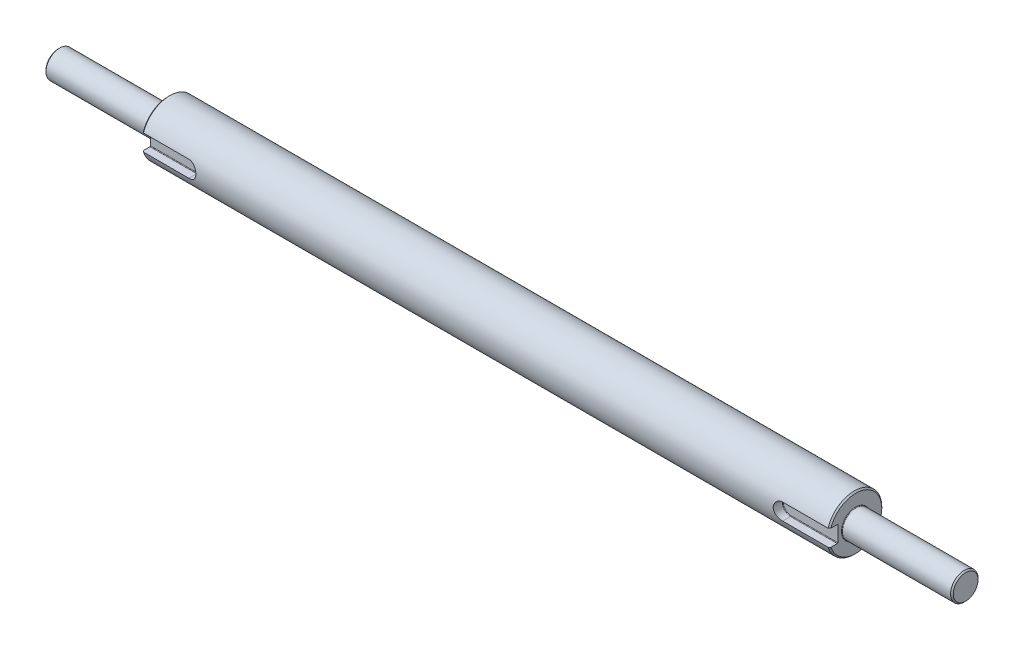
ISO-10303-21;
HEADER;
FILE_DESCRIPTION(('STEP AP214'),'2;1');
FILE_NAME('part.step','',(''),(''),'','','');
FILE_SCHEMA(('AUTOMOTIVE_DESIGN { 1 0 10303 214 1 1 1 1 }'));
ENDSEC;
DATA;
#1=APPLICATION_CONTEXT('core data for automotive mechanical design processes');
#2=APPLICATION_PROTOCOL_DEFINITION('international standard','automotive_design',2000,#1);
#3=PRODUCT_CONTEXT('',#1,'mechanical');
#4=PRODUCT('Part','Part','',(#3));
#5=PRODUCT_RELATED_PRODUCT_CATEGORY('part','',(#4));
#6=PRODUCT_DEFINITION_FORMATION('','',#4);
#7=PRODUCT_DEFINITION_CONTEXT('part definition',#1,'design');
#8=PRODUCT_DEFINITION('design','',#6,#7);
#9=PRODUCT_DEFINITION_SHAPE('','',#8);
#10=(LENGTH_UNIT() NAMED_UNIT(*) SI_UNIT(.MILLI.,.METRE.));
#11=(NAMED_UNIT(*) PLANE_ANGLE_UNIT() SI_UNIT($,.RADIAN.));
#12=(NAMED_UNIT(*) SI_UNIT($,.STERADIAN.) SOLID_ANGLE_UNIT());
#13=UNCERTAINTY_MEASURE_WITH_UNIT(LENGTH_MEASURE(1.E-05),#10,'distance_accuracy_value','');
#14=(GEOMETRIC_REPRESENTATION_CONTEXT(3) GLOBAL_UNCERTAINTY_ASSIGNED_CONTEXT((#13)) GLOBAL_UNIT_ASSIGNED_CONTEXT((#10,
#11,#12)) REPRESENTATION_CONTEXT('',''));
#15=CARTESIAN_POINT('',(0.,0.,0.));
#16=DIRECTION('',(0.,0.,1.));
#17=DIRECTION('',(1.,0.,0.));
#18=AXIS2_PLACEMENT_3D('',#15,#16,#17);
#19=CARTESIAN_POINT('',(330.,5.,0.));
#20=DIRECTION('',(-1.,0.,0.));
#21=DIRECTION('',(0.,0.,1.));
#22=AXIS2_PLACEMENT_3D('',#19,#20,#21);
#23=PLANE('',#22);
#24=CARTESIAN_POINT('',(330.,0.,0.));
#25=DIRECTION('',(-1.,0.,0.));
#26=DIRECTION('',(0.,0.,1.));
#27=AXIS2_PLACEMENT_3D('',#24,#25,#26);
#28=CIRCLE('',#27,4.50000000000006);
#29=CARTESIAN_POINT('',(330.,0.,4.50000000000006));
#30=VERTEX_POINT('',#29);
#31=EDGE_CURVE('E250',#30,#30,#28,.F.);
#32=ORIENTED_EDGE('',*,*,#31,.T.);
#33=EDGE_LOOP('',(#32));
#34=FACE_BOUND('',#33,.T.);
#35=ADVANCED_FACE('F49',(#34),#23,.F.);
#36=CARTESIAN_POINT('',(0.,0.,0.));
#37=DIRECTION('',(-1.,0.,0.));
#38=DIRECTION('',(0.,0.,1.));
#39=AXIS2_PLACEMENT_3D('',#36,#37,#38);
#40=CYLINDRICAL_SURFACE('',#39,5.);
#41=CARTESIAN_POINT('',(290.2,0.,0.));
#42=DIRECTION('',(-1.,0.,0.));
#43=DIRECTION('',(0.,0.,1.));
#44=AXIS2_PLACEMENT_3D('',#41,#42,#43);
#45=CIRCLE('',#44,5.);
#46=CARTESIAN_POINT('',(290.2,0.,5.));
#47=VERTEX_POINT('',#46);
#48=EDGE_CURVE('E262',#47,#47,#45,.F.);
#49=ORIENTED_EDGE('',*,*,#48,.T.);
#50=EDGE_LOOP('',(#49));
#51=FACE_BOUND('',#50,.T.);
#52=CARTESIAN_POINT('',(329.5,0.,0.));
#53=DIRECTION('',(-1.,0.,0.));
#54=DIRECTION('',(0.,0.,1.));
#55=AXIS2_PLACEMENT_3D('',#52,#53,#54);
#56=CIRCLE('',#55,5.);
#57=CARTESIAN_POINT('',(329.5,0.,5.));
#58=VERTEX_POINT('',#57);
#59=EDGE_CURVE('E247',#58,#58,#56,.T.);
#60=ORIENTED_EDGE('',*,*,#59,.T.);
#61=EDGE_LOOP('',(#60));
#62=FACE_BOUND('',#61,.T.);
#63=ADVANCED_FACE('F353',(#51,#62),#40,.T.);
#64=CARTESIAN_POINT('',(290.,5.,0.));
#65=DIRECTION('',(-1.,0.,0.));
#66=DIRECTION('',(0.,0.,1.));
#67=AXIS2_PLACEMENT_3D('',#64,#65,#66);
#68=PLANE('',#67);
#69=CARTESIAN_POINT('',(290.,0.,0.));
#70=DIRECTION('',(-1.,0.,0.));
#71=DIRECTION('',(0.,0.,1.));
#72=AXIS2_PLACEMENT_3D('',#69,#70,#71);
#73=CIRCLE('',#72,9.49999999999995);
#74=CARTESIAN_POINT('',(290.,-3.,9.01387818865992));
#75=VERTEX_POINT('',#74);
#76=CARTESIAN_POINT('',(290.,3.,9.01387818865992));
#77=VERTEX_POINT('',#76);
#78=EDGE_CURVE('E233',#75,#77,#73,.F.);
#79=ORIENTED_EDGE('',*,*,#78,.T.);
#80=DIRECTION('',(0.,0.,1.));
#81=VECTOR('',#80,1.);
#82=CARTESIAN_POINT('',(290.,3.,6.5));
#83=LINE('',#82,#81);
#84=CARTESIAN_POINT('',(290.,3.,6.7));
#85=VERTEX_POINT('',#84);
#86=EDGE_CURVE('E64',#77,#85,#83,.F.);
#87=ORIENTED_EDGE('',*,*,#86,.T.);
#88=CARTESIAN_POINT('',(290.,2.8,6.7));
#89=DIRECTION('',(1.,0.,0.));
#90=DIRECTION('',(0.,0.,-1.));
#91=AXIS2_PLACEMENT_3D('',#88,#89,#90);
#92=CIRCLE('',#91,0.2);
#93=CARTESIAN_POINT('',(290.,2.8,6.5));
#94=VERTEX_POINT('',#93);
#95=EDGE_CURVE('E162',#94,#85,#92,.T.);
#96=ORIENTED_EDGE('',*,*,#95,.F.);
#97=DIRECTION('',(0.,-1.,0.));
#98=VECTOR('',#97,1.);
#99=CARTESIAN_POINT('',(290.,5.,6.5));
#100=LINE('',#99,#98);
#101=CARTESIAN_POINT('',(290.,-2.8,6.5));
#102=VERTEX_POINT('',#101);
#103=EDGE_CURVE('E13',#94,#102,#100,.T.);
#104=ORIENTED_EDGE('',*,*,#103,.T.);
#105=CARTESIAN_POINT('',(290.,-2.8,6.7));
#106=DIRECTION('',(1.,0.,0.));
#107=DIRECTION('',(0.,0.,-1.));
#108=AXIS2_PLACEMENT_3D('',#105,#106,#107);
#109=CIRCLE('',#108,0.2);
#110=CARTESIAN_POINT('',(290.,-3.,6.7));
#111=VERTEX_POINT('',#110);
#112=EDGE_CURVE('E151',#111,#102,#109,.T.);
#113=ORIENTED_EDGE('',*,*,#112,.F.);
#114=DIRECTION('',(0.,0.,1.));
#115=VECTOR('',#114,1.);
#116=CARTESIAN_POINT('',(290.,-3.,6.5));
#117=LINE('',#116,#115);
#118=EDGE_CURVE('E387',#111,#75,#117,.T.);
#119=ORIENTED_EDGE('',*,*,#118,.T.);
#120=EDGE_LOOP('',(#79,#87,#96,#104,#113,#119));
#121=FACE_BOUND('',#120,.T.);
#122=CARTESIAN_POINT('',(290.,0.,0.));
#123=DIRECTION('',(-1.,0.,0.));
#124=DIRECTION('',(0.,0.,1.));
#125=AXIS2_PLACEMENT_3D('',#122,#123,#124);
#126=CIRCLE('',#125,5.2);
#127=CARTESIAN_POINT('',(290.,0.,5.2));
#128=VERTEX_POINT('',#127);
#129=EDGE_CURVE('E259',#128,#128,#126,.T.);
#130=ORIENTED_EDGE('',*,*,#129,.T.);
#131=EDGE_LOOP('',(#130));
#132=FACE_BOUND('',#131,.T.);
#133=ADVANCED_FACE('F174',(#121,#132),#68,.F.);
#134=CARTESIAN_POINT('',(0.,0.,0.));
#135=DIRECTION('',(-1.,0.,0.));
#136=DIRECTION('',(0.,0.,1.));
#137=AXIS2_PLACEMENT_3D('',#134,#135,#136);
#138=CYLINDRICAL_SURFACE('',#137,9.99999999999998);
#139=CARTESIAN_POINT('',(60.,0.,9.99999999999998));
#140=CARTESIAN_POINT('',(59.9999980050302,-0.1645772255066,9.99999858501098));
#141=CARTESIAN_POINT('',(59.9864122727521,-0.329174636703059,9.99589831387905));
#142=CARTESIAN_POINT('',(59.9325572915558,-0.653576250609761,9.97994211187379));
#143=CARTESIAN_POINT('',(59.8922800839533,-0.813379008822839,9.96808386779382));
#144=CARTESIAN_POINT('',(59.7865079661795,-1.12346541550905,9.93791105003671));
#145=CARTESIAN_POINT('',(59.7210502607622,-1.27376272879074,9.91960600500848));
#146=CARTESIAN_POINT('',(59.5669278138883,-1.56124836210626,9.87844218475288));
#147=CARTESIAN_POINT('',(59.4782599852092,-1.69843493493934,9.85558280384131));
#148=CARTESIAN_POINT('',(59.2775519850547,-1.95974359436749,9.80701474385546));
#149=CARTESIAN_POINT('',(59.1649667482282,-2.08343614248867,9.7812476731407));
#150=CARTESIAN_POINT('',(58.9207815401797,-2.31049841846647,9.73011668420882));
#151=CARTESIAN_POINT('',(58.7891783757501,-2.41386472654881,9.70475283449001));
#152=CARTESIAN_POINT('',(58.5070584939248,-2.59960075447415,9.65668227987542));
#153=CARTESIAN_POINT('',(58.3561830780186,-2.68144618044426,9.63404813327747));
#154=CARTESIAN_POINT('',(58.0420214915394,-2.8184278954952,9.5948724078806));
#155=CARTESIAN_POINT('',(57.8787383121441,-2.87357059839946,9.57832936626619));
#156=CARTESIAN_POINT('',(57.5492194677391,-2.95403267365303,9.55381741676866));
#157=CARTESIAN_POINT('',(57.3831945122721,-2.98014392469354,9.54562138649064));
#158=CARTESIAN_POINT('',(57.0489336875665,-3.00427461229343,9.53805579499532));
#159=CARTESIAN_POINT('',(56.8806983638818,-3.00230085522156,9.5386840952114));
#160=CARTESIAN_POINT('',(56.5532321827831,-2.97093954399623,9.54849488135553));
#161=CARTESIAN_POINT('',(56.3938954992755,-2.9425441052537,9.55736777198279));
#162=CARTESIAN_POINT('',(56.0823604274531,-2.86074840854111,9.58216712457246));
#163=CARTESIAN_POINT('',(55.9301627452514,-2.80734568283281,9.59809428264699));
#164=CARTESIAN_POINT('',(55.6347993006785,-2.67632053307362,9.63545466149944));
#165=CARTESIAN_POINT('',(55.4917858320895,-2.59837633869284,9.65696032231902));
#166=CARTESIAN_POINT('',(55.2205359559796,-2.42070445177366,9.70301974000127));
#167=CARTESIAN_POINT('',(55.0923031411725,-2.32097148005176,9.7275742349398));
#168=CARTESIAN_POINT('',(54.848627618476,-2.09762581531092,9.77822022595872));
#169=CARTESIAN_POINT('',(54.7339426719407,-1.97318981493394,9.80433308620993));
#170=CARTESIAN_POINT('',(54.5268920318715,-1.70652651862793,9.85424488126515));
#171=CARTESIAN_POINT('',(54.4345277431712,-1.56429810372177,9.87804367036818));
#172=CARTESIAN_POINT('',(54.2742801550706,-1.2647100766856,9.92086320138939));
#173=CARTESIAN_POINT('',(54.2065649675003,-1.10725549949589,9.93985087336626));
#174=CARTESIAN_POINT('',(54.0988008198008,-0.78249083120703,9.97067043664442));
#175=CARTESIAN_POINT('',(54.0587441429351,-0.615183503179155,9.98250432373997));
#176=CARTESIAN_POINT('',(54.0086956442012,-0.281904485336654,9.99736729287074));
#177=CARTESIAN_POINT('',(53.9976768283968,-0.116100195202365,10.0006970083558));
#178=CARTESIAN_POINT('',(54.0031383114242,0.214999211646775,9.99905846483517));
#179=CARTESIAN_POINT('',(54.0196149393029,0.38029439338157,9.99409131355512));
#180=CARTESIAN_POINT('',(54.078769222223,0.701807210619402,9.97661393974322));
#181=CARTESIAN_POINT('',(54.1208467751618,0.858145545228346,9.96427659598826));
#182=CARTESIAN_POINT('',(54.2292864655564,1.16150927790905,9.93348695683068));
#183=CARTESIAN_POINT('',(54.2956515220758,1.30853355405118,9.91503392642185));
#184=CARTESIAN_POINT('',(54.4525063309623,1.59287437892211,9.87339308702628));
#185=CARTESIAN_POINT('',(54.543518681896,1.72988765239934,9.85010561659278));
#186=CARTESIAN_POINT('',(54.7464495081056,1.9870466159603,9.80146937528702));
#187=CARTESIAN_POINT('',(54.8583732237753,2.10718806471189,9.77612008862417));
#188=CARTESIAN_POINT('',(55.1047746167388,2.33171489102053,9.72506343738004));
#189=CARTESIAN_POINT('',(55.2399237515437,2.43536962463002,9.69937650065511));
#190=CARTESIAN_POINT('',(55.5262558780269,2.61857990144313,9.65153030477946));
#191=CARTESIAN_POINT('',(55.6774384491158,2.69813607658965,9.62937095313119));
#192=CARTESIAN_POINT('',(55.9910649825101,2.83034694254316,9.59134379226307));
#193=CARTESIAN_POINT('',(56.1534523730757,2.88312693874022,9.57544675673498));
#194=CARTESIAN_POINT('',(56.4853759378605,2.96043461630306,9.55183188739734));
#195=CARTESIAN_POINT('',(56.6549096415661,2.98497197957849,9.54411125069385));
#196=CARTESIAN_POINT('',(56.9887230367769,3.0044396896993,9.53799944941556));
#197=CARTESIAN_POINT('',(57.1529273020989,3.00056110615887,9.53923294700392));
#198=CARTESIAN_POINT('',(57.4782282068013,2.9661501088861,9.54998802392186));
#199=CARTESIAN_POINT('',(57.6393249703611,2.93561876249407,9.55950927135899));
#200=CARTESIAN_POINT('',(57.9518907982634,2.84953777608686,9.58551527389241));
#201=CARTESIAN_POINT('',(58.1034545747174,2.79430351014248,9.60191209104932));
#202=CARTESIAN_POINT('',(58.3952848776415,2.66063014242147,9.63980557805263));
#203=CARTESIAN_POINT('',(58.5355492352832,2.58218659925722,9.66130322385078));
#204=CARTESIAN_POINT('',(58.8063262330526,2.40097527610175,9.70795352855336));
#205=CARTESIAN_POINT('',(58.9362975225204,2.29742552185995,9.73321080328578));
#206=CARTESIAN_POINT('',(59.1774049966162,2.07034869259555,9.78402640899064));
#207=CARTESIAN_POINT('',(59.2885362789357,1.94681643426897,9.80958481647541));
#208=CARTESIAN_POINT('',(59.49204682459,1.67893152436651,9.85901873141571));
#209=CARTESIAN_POINT('',(59.583782893711,1.53407577158122,9.8828231953142));
#210=CARTESIAN_POINT('',(59.7414703398081,1.23028274796705,9.92521360911551));
#211=CARTESIAN_POINT('',(59.8074337765491,1.0713521059979,9.94380199862112));
#212=CARTESIAN_POINT('',(59.9057905513055,0.76151542531056,9.97204349938616));
#213=CARTESIAN_POINT('',(59.9410233457665,0.611573923908465,9.98244054762137));
#214=CARTESIAN_POINT('',(59.9881270504832,0.307760390461556,9.99641888988978));
#215=CARTESIAN_POINT('',(60.0000018654097,0.153889019716278,10.0000013230948));
#216=CARTESIAN_POINT('',(60.,0.,9.99999999999998));
#217=B_SPLINE_CURVE_WITH_KNOTS('',3,(#139,#140,#141,#142,#143,#144,#145,#146,#147,#148,#149,
#150,#151,#152,#153,#154,#155,#156,#157,#158,#159,#160,#161,#162,#163,#164,#165,#166,#167,#168,
#169,#170,#171,#172,#173,#174,#175,#176,#177,#178,#179,#180,#181,#182,#183,#184,#185,#186,#187,
#188,#189,#190,#191,#192,#193,#194,#195,#196,#197,#198,#199,#200,#201,#202,#203,#204,#205,#206,
#207,#208,#209,#210,#211,#212,#213,#214,#215,#216),.UNSPECIFIED.,.T.,.F.,(4,2,2,2,2,2,2,2,2,2,2,
2,2,2,2,2,2,2,2,2,2,2,2,2,2,2,2,2,2,2,2,2,2,2,2,2,2,2,4),(0.,0.493166407225221,
0.986479929691998,1.47906735260175,1.9717203288254,2.47711205896382,2.98258874577265,
3.49942962008217,4.01614629086447,4.51839378713198,5.02051956638178,5.50452033395352,
5.98856887316002,6.47924852894238,6.9700472031711,7.48134208096332,7.99266913062142,
8.50742093763376,9.02202907057614,9.51817618877089,10.0142570710065,10.4991349336465,
10.9840710918746,11.4802261140581,11.9765056400038,12.4908080064564,13.0050968850536,
13.516956299025,14.0286401892056,14.5190031093854,15.0093463933232,15.4936008081456,
15.9779479511533,16.4799385136898,16.9820594980412,17.4988599232246,18.0154182319959,
18.4766338387004,18.9377723390687),.UNSPECIFIED.);
#218=CARTESIAN_POINT('',(57.,3.,9.53939201416943));
#219=VERTEX_POINT('',#218);
#220=CARTESIAN_POINT('',(57.,-2.99999999999999,9.53939201416943));
#221=VERTEX_POINT('',#220);
#222=EDGE_CURVE('E299',#219,#221,#217,.T.);
#223=ORIENTED_EDGE('',*,*,#222,.T.);
#224=DIRECTION('',(-1.,0.,0.));
#225=VECTOR('',#224,1.);
#226=CARTESIAN_POINT('',(0.,-3.,9.53939201416943));
#227=LINE('',#226,#225);
#228=CARTESIAN_POINT('',(40.5,-3.,9.53939201416943));
#229=VERTEX_POINT('',#228);
#230=EDGE_CURVE('E227',#221,#229,#227,.T.);
#231=ORIENTED_EDGE('',*,*,#230,.T.);
#232=CARTESIAN_POINT('',(40.5,0.,0.));
#233=DIRECTION('',(1.,0.,0.));
#234=DIRECTION('',(0.,0.,-1.));
#235=AXIS2_PLACEMENT_3D('',#232,#233,#234);
#236=CIRCLE('',#235,9.99999999999998);
#237=CARTESIAN_POINT('',(40.5,3.,9.53939201416943));
#238=VERTEX_POINT('',#237);
#239=EDGE_CURVE('E238',#229,#238,#236,.T.);
#240=ORIENTED_EDGE('',*,*,#239,.T.);
#241=DIRECTION('',(-1.,0.,0.));
#242=VECTOR('',#241,1.);
#243=CARTESIAN_POINT('',(0.,2.99999999999999,9.53939201416943));
#244=LINE('',#243,#242);
#245=EDGE_CURVE('E72',#238,#219,#244,.F.);
#246=ORIENTED_EDGE('',*,*,#245,.T.);
#247=EDGE_LOOP('',(#223,#231,#240,#246));
#248=FACE_BOUND('',#247,.T.);
#249=DIRECTION('',(-1.,0.,0.));
#250=VECTOR('',#249,1.);
#251=CARTESIAN_POINT('',(0.,-3.00000000000003,9.53939201416942));
#252=LINE('',#251,#250);
#253=CARTESIAN_POINT('',(289.5,-3.,9.53939201416943));
#254=VERTEX_POINT('',#253);
#255=CARTESIAN_POINT('',(273.,-3.,9.53939201416942));
#256=VERTEX_POINT('',#255);
#257=EDGE_CURVE('E188',#254,#256,#252,.T.);
#258=ORIENTED_EDGE('',*,*,#257,.T.);
#259=CARTESIAN_POINT('',(276.,0.,9.99999999999998));
#260=CARTESIAN_POINT('',(275.99999800503,-0.164577225506596,9.99999858501098));
#261=CARTESIAN_POINT('',(275.986412272752,-0.329174636703053,9.99589831387905));
#262=CARTESIAN_POINT('',(275.932557291556,-0.653576250609755,9.97994211187379));
#263=CARTESIAN_POINT('',(275.892280083953,-0.813379008822833,9.96808386779382));
#264=CARTESIAN_POINT('',(275.786507966179,-1.12346541550904,9.93791105003671));
#265=CARTESIAN_POINT('',(275.721050260762,-1.27376272879073,9.91960600500849));
#266=CARTESIAN_POINT('',(275.566927813888,-1.56124836210625,9.87844218475288));
#267=CARTESIAN_POINT('',(275.478259985209,-1.69843493493934,9.85558280384131));
#268=CARTESIAN_POINT('',(275.277551985055,-1.95974359436747,9.80701474385546));
#269=CARTESIAN_POINT('',(275.164966748228,-2.08343614248864,9.78124767314071));
#270=CARTESIAN_POINT('',(274.92078154018,-2.31049841846643,9.73011668420883));
#271=CARTESIAN_POINT('',(274.78917837575,-2.41386472654879,9.70475283449001));
#272=CARTESIAN_POINT('',(274.507058493925,-2.59960075447415,9.65668227987542));
#273=CARTESIAN_POINT('',(274.356183078018,-2.68144618044426,9.63404813327747));
#274=CARTESIAN_POINT('',(274.042021491539,-2.8184278954952,9.5948724078806));
#275=CARTESIAN_POINT('',(273.878738312144,-2.87357059839946,9.57832936626619));
#276=CARTESIAN_POINT('',(273.549219467739,-2.95403267365302,9.55381741676866));
#277=CARTESIAN_POINT('',(273.383194512272,-2.98014392469354,9.54562138649065));
#278=CARTESIAN_POINT('',(273.048933687566,-3.00427461229344,9.53805579499532));
#279=CARTESIAN_POINT('',(272.880698363882,-3.00230085522157,9.5386840952114));
#280=CARTESIAN_POINT('',(272.553232182783,-2.97093954399623,9.54849488135553));
#281=CARTESIAN_POINT('',(272.393895499276,-2.94254410525371,9.55736777198279));
#282=CARTESIAN_POINT('',(272.082360427453,-2.86074840854114,9.58216712457245));
#283=CARTESIAN_POINT('',(271.930162745251,-2.80734568283284,9.59809428264698));
#284=CARTESIAN_POINT('',(271.634799300679,-2.67632053307366,9.63545466149943));
#285=CARTESIAN_POINT('',(271.491785832089,-2.59837633869288,9.65696032231901));
#286=CARTESIAN_POINT('',(271.22053595598,-2.42070445177369,9.70301974000126));
#287=CARTESIAN_POINT('',(271.092303141172,-2.32097148005179,9.72757423493979));
#288=CARTESIAN_POINT('',(270.848627618476,-2.09762581531094,9.77822022595872));
#289=CARTESIAN_POINT('',(270.733942671941,-1.97318981493396,9.80433308620993));
#290=CARTESIAN_POINT('',(270.526892031871,-1.70652651862794,9.85424488126515));
#291=CARTESIAN_POINT('',(270.434527743171,-1.56429810372178,9.87804367036818));
#292=CARTESIAN_POINT('',(270.274280155071,-1.26471007668561,9.92086320138938));
#293=CARTESIAN_POINT('',(270.2065649675,-1.10725549949592,9.93985087336625));
#294=CARTESIAN_POINT('',(270.098800819801,-0.782490831207056,9.97067043664442));
#295=CARTESIAN_POINT('',(270.058744142935,-0.615183503179171,9.98250432373996));
#296=CARTESIAN_POINT('',(270.008695644201,-0.281904485336664,9.99736729287074));
#297=CARTESIAN_POINT('',(269.997676828397,-0.116100195202377,10.0006970083558));
#298=CARTESIAN_POINT('',(270.003138311424,0.214999211646759,9.99905846483517));
#299=CARTESIAN_POINT('',(270.019614939303,0.380294393381553,9.99409131355512));
#300=CARTESIAN_POINT('',(270.078769222223,0.701807210619382,9.97661393974322));
#301=CARTESIAN_POINT('',(270.120846775162,0.858145545228325,9.96427659598826));
#302=CARTESIAN_POINT('',(270.229286465556,1.16150927790903,9.93348695683068));
#303=CARTESIAN_POINT('',(270.295651522076,1.30853355405116,9.91503392642186));
#304=CARTESIAN_POINT('',(270.452506330962,1.5928743789221,9.87339308702629));
#305=CARTESIAN_POINT('',(270.543518681896,1.72988765239934,9.85010561659278));
#306=CARTESIAN_POINT('',(270.746449508106,1.98704661596031,9.80146937528702));
#307=CARTESIAN_POINT('',(270.858373223775,2.10718806471189,9.77612008862418));
#308=CARTESIAN_POINT('',(271.104774616739,2.33171489102052,9.72506343738004));
#309=CARTESIAN_POINT('',(271.239923751544,2.43536962463002,9.69937650065511));
#310=CARTESIAN_POINT('',(271.526255878027,2.61857990144313,9.65153030477946));
#311=CARTESIAN_POINT('',(271.677438449116,2.69813607658965,9.62937095313119));
#312=CARTESIAN_POINT('',(271.99106498251,2.83034694254315,9.59134379226307));
#313=CARTESIAN_POINT('',(272.153452373076,2.88312693874022,9.57544675673498));
#314=CARTESIAN_POINT('',(272.48537593786,2.96043461630307,9.55183188739734));
#315=CARTESIAN_POINT('',(272.654909641566,2.98497197957849,9.54411125069385));
#316=CARTESIAN_POINT('',(272.988723036777,3.0044396896993,9.53799944941556));
#317=CARTESIAN_POINT('',(273.152927302099,3.00056110615887,9.53923294700392));
#318=CARTESIAN_POINT('',(273.478228206801,2.9661501088861,9.54998802392186));
#319=CARTESIAN_POINT('',(273.639324970361,2.93561876249407,9.559509271359));
#320=CARTESIAN_POINT('',(273.951890798263,2.84953777608685,9.58551527389241));
#321=CARTESIAN_POINT('',(274.103454574717,2.79430351014246,9.60191209104932));
#322=CARTESIAN_POINT('',(274.395284877641,2.66063014242145,9.63980557805263));
#323=CARTESIAN_POINT('',(274.535549235283,2.5821865992572,9.66130322385079));
#324=CARTESIAN_POINT('',(274.806326233053,2.40097527610173,9.70795352855336));
#325=CARTESIAN_POINT('',(274.93629752252,2.29742552185994,9.73321080328578));
#326=CARTESIAN_POINT('',(275.177404996616,2.07034869259554,9.78402640899064));
#327=CARTESIAN_POINT('',(275.288536278936,1.94681643426897,9.80958481647541));
#328=CARTESIAN_POINT('',(275.49204682459,1.67893152436651,9.85901873141571));
#329=CARTESIAN_POINT('',(275.583782893711,1.53407577158121,9.8828231953142));
#330=CARTESIAN_POINT('',(275.741470339808,1.23028274796704,9.92521360911551));
#331=CARTESIAN_POINT('',(275.807433776549,1.0713521059979,9.94380199862112));
#332=CARTESIAN_POINT('',(275.905790551305,0.761515425310561,9.97204349938616));
#333=CARTESIAN_POINT('',(275.941023345766,0.611573923908464,9.98244054762138));
#334=CARTESIAN_POINT('',(275.988127050483,0.307760390461555,9.99641888988978));
#335=CARTESIAN_POINT('',(276.00000186541,0.153889019716278,10.0000013230948));
#336=CARTESIAN_POINT('',(276.,0.,9.99999999999998));
#337=B_SPLINE_CURVE_WITH_KNOTS('',3,(#259,#260,#261,#262,#263,#264,#265,#266,#267,#268,#269,
#270,#271,#272,#273,#274,#275,#276,#277,#278,#279,#280,#281,#282,#283,#284,#285,#286,#287,#288,
#289,#290,#291,#292,#293,#294,#295,#296,#297,#298,#299,#300,#301,#302,#303,#304,#305,#306,#307,
#308,#309,#310,#311,#312,#313,#314,#315,#316,#317,#318,#319,#320,#321,#322,#323,#324,#325,#326,
#327,#328,#329,#330,#331,#332,#333,#334,#335,#336),.UNSPECIFIED.,.T.,.F.,(4,2,2,2,2,2,2,2,2,2,2,
2,2,2,2,2,2,2,2,2,2,2,2,2,2,2,2,2,2,2,2,2,2,2,2,2,2,2,4),(0.,0.493166407225214,
0.986479929691996,1.47906735260173,1.97172032882538,2.47711205896378,2.98258874577263,
3.49942962008214,4.01614629086449,4.51839378713192,5.02051956638177,5.50452033395344,
5.98856887315995,6.47924852894232,6.97004720317106,7.48134208096331,7.9926691306214,
8.50742093763375,9.02202907057615,9.51817618877089,10.0142570710065,10.4991349336465,
10.9840710918745,11.4802261140582,11.9765056400038,12.4908080064563,13.0050968850536,
13.516956299025,14.0286401892056,14.5190031093854,15.0093463933232,15.4936008081456,
15.9779479511534,16.4799385136898,16.9820594980412,17.4988599232246,18.0154182319959,
18.4766338387004,18.9377723390687),.UNSPECIFIED.);
#338=CARTESIAN_POINT('',(273.,3.,9.53939201416942));
#339=VERTEX_POINT('',#338);
#340=EDGE_CURVE('E57',#256,#339,#337,.T.);
#341=ORIENTED_EDGE('',*,*,#340,.T.);
#342=DIRECTION('',(-1.,0.,0.));
#343=VECTOR('',#342,1.);
#344=CARTESIAN_POINT('',(0.,3.00000000000003,9.53939201416942));
#345=LINE('',#344,#343);
#346=CARTESIAN_POINT('',(289.5,3.,9.53939201416943));
#347=VERTEX_POINT('',#346);
#348=EDGE_CURVE('E185',#339,#347,#345,.F.);
#349=ORIENTED_EDGE('',*,*,#348,.T.);
#350=CARTESIAN_POINT('',(289.5,0.,0.));
#351=DIRECTION('',(-1.,0.,0.));
#352=DIRECTION('',(0.,0.,1.));
#353=AXIS2_PLACEMENT_3D('',#350,#351,#352);
#354=CIRCLE('',#353,9.99999999999998);
#355=EDGE_CURVE('E230',#347,#254,#354,.T.);
#356=ORIENTED_EDGE('',*,*,#355,.T.);
#357=EDGE_LOOP('',(#258,#341,#349,#356));
#358=FACE_BOUND('',#357,.T.);
#359=ADVANCED_FACE('F311',(#248,#358),#138,.T.);
#360=CARTESIAN_POINT('',(40.,9.99999999999996,0.));
#361=DIRECTION('',(1.,0.,0.));
#362=DIRECTION('',(0.,0.,-1.));
#363=AXIS2_PLACEMENT_3D('',#360,#361,#362);
#364=PLANE('',#363);
#365=CARTESIAN_POINT('',(40.,0.,0.));
#366=DIRECTION('',(1.,0.,0.));
#367=DIRECTION('',(0.,0.,-1.));
#368=AXIS2_PLACEMENT_3D('',#365,#366,#367);
#369=CIRCLE('',#368,5.2);
#370=CARTESIAN_POINT('',(40.,0.,-5.2));
#371=VERTEX_POINT('',#370);
#372=EDGE_CURVE('E256',#371,#371,#369,.T.);
#373=ORIENTED_EDGE('',*,*,#372,.T.);
#374=EDGE_LOOP('',(#373));
#375=FACE_BOUND('',#374,.T.);
#376=CARTESIAN_POINT('',(40.,2.8,6.7));
#377=DIRECTION('',(-1.,0.,0.));
#378=DIRECTION('',(0.,0.,1.));
#379=AXIS2_PLACEMENT_3D('',#376,#377,#378);
#380=CIRCLE('',#379,0.2);
#381=CARTESIAN_POINT('',(40.,3.,6.7));
#382=VERTEX_POINT('',#381);
#383=CARTESIAN_POINT('',(40.,2.8,6.5));
#384=VERTEX_POINT('',#383);
#385=EDGE_CURVE('E191',#382,#384,#380,.T.);
#386=ORIENTED_EDGE('',*,*,#385,.F.);
#387=DIRECTION('',(0.,0.,1.));
#388=VECTOR('',#387,1.);
#389=CARTESIAN_POINT('',(40.,3.,6.5));
#390=LINE('',#389,#388);
#391=CARTESIAN_POINT('',(40.,3.,9.01387818865997));
#392=VERTEX_POINT('',#391);
#393=EDGE_CURVE('E192',#382,#392,#390,.T.);
#394=ORIENTED_EDGE('',*,*,#393,.T.);
#395=CARTESIAN_POINT('',(40.,0.,0.));
#396=DIRECTION('',(1.,0.,0.));
#397=DIRECTION('',(0.,0.,-1.));
#398=AXIS2_PLACEMENT_3D('',#395,#396,#397);
#399=CIRCLE('',#398,9.49999999999998);
#400=CARTESIAN_POINT('',(40.,-3.,9.01387818865998));
#401=VERTEX_POINT('',#400);
#402=EDGE_CURVE('E235',#392,#401,#399,.F.);
#403=ORIENTED_EDGE('',*,*,#402,.T.);
#404=DIRECTION('',(0.,0.,1.));
#405=VECTOR('',#404,1.);
#406=CARTESIAN_POINT('',(40.,-3.,6.5));
#407=LINE('',#406,#405);
#408=CARTESIAN_POINT('',(40.,-3.,6.7));
#409=VERTEX_POINT('',#408);
#410=EDGE_CURVE('E195',#401,#409,#407,.F.);
#411=ORIENTED_EDGE('',*,*,#410,.T.);
#412=CARTESIAN_POINT('',(40.,-2.8,6.7));
#413=DIRECTION('',(-1.,0.,0.));
#414=DIRECTION('',(0.,0.,1.));
#415=AXIS2_PLACEMENT_3D('',#412,#413,#414);
#416=CIRCLE('',#415,0.2);
#417=CARTESIAN_POINT('',(40.,-2.8,6.5));
#418=VERTEX_POINT('',#417);
#419=EDGE_CURVE('E219',#418,#409,#416,.T.);
#420=ORIENTED_EDGE('',*,*,#419,.F.);
#421=DIRECTION('',(0.,-1.,0.));
#422=VECTOR('',#421,1.);
#423=CARTESIAN_POINT('',(40.,9.99999999999996,6.5));
#424=LINE('',#423,#422);
#425=EDGE_CURVE('E305',#384,#418,#424,.T.);
#426=ORIENTED_EDGE('',*,*,#425,.F.);
#427=EDGE_LOOP('',(#386,#394,#403,#411,#420,#426));
#428=FACE_BOUND('',#427,.T.);
#429=ADVANCED_FACE('F316',(#375,#428),#364,.F.);
#430=CARTESIAN_POINT('',(0.,0.,0.));
#431=DIRECTION('',(-1.,0.,0.));
#432=DIRECTION('',(0.,0.,1.));
#433=AXIS2_PLACEMENT_3D('',#430,#431,#432);
#434=CYLINDRICAL_SURFACE('',#433,5.);
#435=CARTESIAN_POINT('',(39.8,0.,0.));
#436=DIRECTION('',(1.,0.,0.));
#437=DIRECTION('',(0.,0.,-1.));
#438=AXIS2_PLACEMENT_3D('',#435,#436,#437);
#439=CIRCLE('',#438,5.);
#440=CARTESIAN_POINT('',(39.8,0.,-5.));
#441=VERTEX_POINT('',#440);
#442=EDGE_CURVE('E253',#441,#441,#439,.F.);
#443=ORIENTED_EDGE('',*,*,#442,.T.);
#444=EDGE_LOOP('',(#443));
#445=FACE_BOUND('',#444,.T.);
#446=CARTESIAN_POINT('',(0.49999999999993,0.,0.));
#447=DIRECTION('',(1.,0.,0.));
#448=DIRECTION('',(0.,0.,-1.));
#449=AXIS2_PLACEMENT_3D('',#446,#447,#448);
#450=CIRCLE('',#449,5.);
#451=CARTESIAN_POINT('',(0.49999999999993,0.,-5.));
#452=VERTEX_POINT('',#451);
#453=EDGE_CURVE('E244',#452,#452,#450,.T.);
#454=ORIENTED_EDGE('',*,*,#453,.T.);
#455=EDGE_LOOP('',(#454));
#456=FACE_BOUND('',#455,.T.);
#457=ADVANCED_FACE('F372',(#445,#456),#434,.T.);
#458=CARTESIAN_POINT('',(0.,5.,0.));
#459=DIRECTION('',(1.,0.,0.));
#460=DIRECTION('',(0.,0.,-1.));
#461=AXIS2_PLACEMENT_3D('',#458,#459,#460);
#462=PLANE('',#461);
#463=CARTESIAN_POINT('',(0.,0.,0.));
#464=DIRECTION('',(1.,0.,0.));
#465=DIRECTION('',(0.,0.,-1.));
#466=AXIS2_PLACEMENT_3D('',#463,#464,#465);
#467=CIRCLE('',#466,4.50000000000009);
#468=CARTESIAN_POINT('',(0.,0.,-4.50000000000009));
#469=VERTEX_POINT('',#468);
#470=EDGE_CURVE('E241',#469,#469,#467,.F.);
#471=ORIENTED_EDGE('',*,*,#470,.T.);
#472=EDGE_LOOP('',(#471));
#473=FACE_BOUND('',#472,.T.);
#474=ADVANCED_FACE('F363',(#473),#462,.F.);
#475=CARTESIAN_POINT('',(289.5,0.,0.));
#476=DIRECTION('',(-1.,0.,0.));
#477=DIRECTION('',(0.,0.,1.));
#478=AXIS2_PLACEMENT_3D('',#475,#476,#477);
#479=CONICAL_SURFACE('',#478,9.99999999999998,0.785398163397528);
#480=CARTESIAN_POINT('',(285.753475658482,-3.,13.4151754171152));
#481=CARTESIAN_POINT('',(286.110096451223,-3.,13.0497168655209));
#482=CARTESIAN_POINT('',(286.466390278772,-3.,12.683937905954));
#483=CARTESIAN_POINT('',(287.178057749304,-3.,11.951484067358));
#484=CARTESIAN_POINT('',(287.533431389617,-3.,11.5848091857342));
#485=CARTESIAN_POINT('',(288.242895745732,-3.,10.850408249006));
#486=CARTESIAN_POINT('',(288.596986777781,-3.,10.4826824996101));
#487=CARTESIAN_POINT('',(289.30356896501,-3.,9.74567749245606));
#488=CARTESIAN_POINT('',(289.656060079264,-3.,9.37639819541814));
#489=CARTESIAN_POINT('',(290.358910902026,-3.,8.6355791210434));
#490=CARTESIAN_POINT('',(290.709269854241,-3.,8.26403862558099));
#491=CARTESIAN_POINT('',(291.406706177479,-3.,7.51792149794753));
#492=CARTESIAN_POINT('',(291.753783746828,-3.,7.14334505184318));
#493=CARTESIAN_POINT('',(292.270647550234,-3.,6.57793982187977));
#494=CARTESIAN_POINT('',(292.442336521412,-3.,6.38885157667639));
#495=CARTESIAN_POINT('',(292.784073216544,-3.,6.0092042672901));
#496=CARTESIAN_POINT('',(292.95412098,-3.,5.81864523870608));
#497=CARTESIAN_POINT('',(293.292126407004,-3.,5.43560754502947));
#498=CARTESIAN_POINT('',(293.460083635373,-3.,5.24312849479202));
#499=CARTESIAN_POINT('',(293.709885653676,-3.,4.95256131177343));
#500=CARTESIAN_POINT('',(293.792800731284,-3.,4.85539343733122));
#501=CARTESIAN_POINT('',(293.957789080843,-3.,4.66034245511681));
#502=CARTESIAN_POINT('',(294.039862335241,-3.,4.56245933250423));
#503=CARTESIAN_POINT('',(294.121448886918,-3.,4.46416980815387));
#504=B_SPLINE_CURVE_WITH_KNOTS('',3,(#480,#481,#482,#483,#484,#485,#486,#487,#488,#489,#490,
#491,#492,#493,#494,#495,#496,#497,#498,#499,#500,#501,#502,#503),.UNSPECIFIED.,.F.,.F.,(4,2,2,
2,2,2,2,2,2,2,2,4),(0.,1.53187759155654,3.06375962494482,4.59523399102762,6.12674731433971,
7.65877545016642,9.19071039088026,9.95691669507049,10.723104511771,11.4894492420409,
11.8726532164292,12.2558651644645),.UNSPECIFIED.);
#505=EDGE_CURVE('E325',#254,#75,#504,.T.);
#506=ORIENTED_EDGE('',*,*,#505,.F.);
#507=ORIENTED_EDGE('',*,*,#355,.F.);
#508=CARTESIAN_POINT('',(294.121448886918,3.,4.46416980815387));
#509=CARTESIAN_POINT('',(294.039862335241,3.,4.56245933250423));
#510=CARTESIAN_POINT('',(293.957789080843,3.,4.66034245511681));
#511=CARTESIAN_POINT('',(293.792800731284,3.,4.85539343733122));
#512=CARTESIAN_POINT('',(293.709885653676,3.,4.95256131177343));
#513=CARTESIAN_POINT('',(293.460083635373,3.,5.24312849479203));
#514=CARTESIAN_POINT('',(293.292126407004,3.,5.43560754502948));
#515=CARTESIAN_POINT('',(292.95412098,3.,5.81864523870609));
#516=CARTESIAN_POINT('',(292.784073216544,3.,6.0092042672901));
#517=CARTESIAN_POINT('',(292.442336521412,3.,6.38885157667639));
#518=CARTESIAN_POINT('',(292.270647550234,3.,6.57793982187977));
#519=CARTESIAN_POINT('',(291.753783746828,3.,7.14334505184318));
#520=CARTESIAN_POINT('',(291.406706177479,3.,7.51792149794753));
#521=CARTESIAN_POINT('',(290.709269854241,3.,8.26403862558099));
#522=CARTESIAN_POINT('',(290.358910902026,3.,8.6355791210434));
#523=CARTESIAN_POINT('',(289.656060079264,3.,9.37639819541813));
#524=CARTESIAN_POINT('',(289.30356896501,3.,9.74567749245604));
#525=CARTESIAN_POINT('',(288.596986777781,3.,10.4826824996101));
#526=CARTESIAN_POINT('',(288.242895745732,3.,10.850408249006));
#527=CARTESIAN_POINT('',(287.533431389617,3.,11.5848091857342));
#528=CARTESIAN_POINT('',(287.178057749304,3.,11.951484067358));
#529=CARTESIAN_POINT('',(286.466390278772,3.,12.683937905954));
#530=CARTESIAN_POINT('',(286.110096451223,3.,13.0497168655209));
#531=CARTESIAN_POINT('',(285.753475658482,3.,13.4151754171152));
#532=B_SPLINE_CURVE_WITH_KNOTS('',3,(#508,#509,#510,#511,#512,#513,#514,#515,#516,#517,#518,
#519,#520,#521,#522,#523,#524,#525,#526,#527,#528,#529,#530,#531),.UNSPECIFIED.,.F.,.F.,(4,2,2,
2,2,2,2,2,2,2,2,4),(0.,0.38321194803535,0.766415922423627,1.53276065269356,2.29894846939404,
3.06515477358426,4.59708971429811,6.12911785012482,7.66063117343685,9.1921055395197,
10.7239875729079,12.2558651644645),.UNSPECIFIED.);
#533=EDGE_CURVE('E304',#77,#347,#532,.T.);
#534=ORIENTED_EDGE('',*,*,#533,.F.);
#535=ORIENTED_EDGE('',*,*,#78,.F.);
#536=EDGE_LOOP('',(#506,#507,#534,#535));
#537=FACE_BOUND('',#536,.T.);
#538=ADVANCED_FACE('F360',(#537),#479,.T.);
#539=CARTESIAN_POINT('',(40.,0.,0.));
#540=DIRECTION('',(1.,0.,0.));
#541=DIRECTION('',(0.,0.,-1.));
#542=AXIS2_PLACEMENT_3D('',#539,#540,#541);
#543=CONICAL_SURFACE('',#542,9.49999999999998,0.785398163397445);
#544=CARTESIAN_POINT('',(35.878551113082,-3.,4.46416980815423));
#545=CARTESIAN_POINT('',(35.9601376647581,-3.,4.56245933250457));
#546=CARTESIAN_POINT('',(36.0422109191567,-3.,4.66034245511715));
#547=CARTESIAN_POINT('',(36.2071992687154,-3.,4.85539343733155));
#548=CARTESIAN_POINT('',(36.2901143463232,-3.,4.95256131177377));
#549=CARTESIAN_POINT('',(36.5399163646267,-3.,5.24312849479236));
#550=CARTESIAN_POINT('',(36.7078735929955,-3.,5.43560754502979));
#551=CARTESIAN_POINT('',(37.0458790200002,-3.,5.81864523870636));
#552=CARTESIAN_POINT('',(37.2159267834559,-3.,6.00920426729036));
#553=CARTESIAN_POINT('',(37.5576634785881,-3.,6.38885157667664));
#554=CARTESIAN_POINT('',(37.7293524497655,-3.,6.57793982188001));
#555=CARTESIAN_POINT('',(38.2462162531719,-3.,7.14334505184339));
#556=CARTESIAN_POINT('',(38.5932938225211,-3.,7.51792149794771));
#557=CARTESIAN_POINT('',(39.2907301457589,-3.,8.26403862558112));
#558=CARTESIAN_POINT('',(39.6410890979735,-3.,8.6355791210435));
#559=CARTESIAN_POINT('',(40.3439399207358,-3.,9.37639819541817));
#560=CARTESIAN_POINT('',(40.6964310349898,-3.,9.74567749245604));
#561=CARTESIAN_POINT('',(41.403013222219,-3.,10.48268249961));
#562=CARTESIAN_POINT('',(41.7571042542677,-3.,10.8504082490059));
#563=CARTESIAN_POINT('',(42.466568610383,-3.,11.584809185734));
#564=CARTESIAN_POINT('',(42.8219422506959,-3.,11.9514840673578));
#565=CARTESIAN_POINT('',(43.5336097212285,-3.,12.6839379059538));
#566=CARTESIAN_POINT('',(43.8899035487771,-3.,13.0497168655206));
#567=CARTESIAN_POINT('',(44.2465243415187,-3.,13.4151754171149));
#568=B_SPLINE_CURVE_WITH_KNOTS('',3,(#544,#545,#546,#547,#548,#549,#550,#551,#552,#553,#554,
#555,#556,#557,#558,#559,#560,#561,#562,#563,#564,#565,#566,#567),.UNSPECIFIED.,.F.,.F.,(4,2,2,
2,2,2,2,2,2,2,2,4),(0.,0.383211948035348,0.766415922423653,1.53276065269361,2.2989484693941,
3.06515477358434,4.5970897142982,6.12911785012492,7.66063117343693,9.19210553951977,
10.723987572908,12.2558651644646),.UNSPECIFIED.);
#569=EDGE_CURVE('E272',#401,#229,#568,.T.);
#570=ORIENTED_EDGE('',*,*,#569,.F.);
#571=ORIENTED_EDGE('',*,*,#402,.F.);
#572=CARTESIAN_POINT('',(44.2465243415187,3.,13.4151754171149));
#573=CARTESIAN_POINT('',(43.8899035487771,3.,13.0497168655206));
#574=CARTESIAN_POINT('',(43.5336097212285,3.,12.6839379059538));
#575=CARTESIAN_POINT('',(42.8219422506959,3.,11.9514840673578));
#576=CARTESIAN_POINT('',(42.466568610383,3.,11.584809185734));
#577=CARTESIAN_POINT('',(41.7571042542678,3.,10.8504082490059));
#578=CARTESIAN_POINT('',(41.403013222219,3.,10.48268249961));
#579=CARTESIAN_POINT('',(40.6964310349898,3.,9.74567749245605));
#580=CARTESIAN_POINT('',(40.3439399207358,3.,9.37639819541817));
#581=CARTESIAN_POINT('',(39.6410890979735,3.,8.6355791210435));
#582=CARTESIAN_POINT('',(39.2907301457589,3.,8.26403862558112));
#583=CARTESIAN_POINT('',(38.5932938225211,3.,7.5179214979477));
#584=CARTESIAN_POINT('',(38.2462162531719,3.,7.14334505184338));
#585=CARTESIAN_POINT('',(37.7293524497655,3.,6.57793982188001));
#586=CARTESIAN_POINT('',(37.5576634785881,3.,6.38885157667664));
#587=CARTESIAN_POINT('',(37.2159267834559,3.,6.00920426729036));
#588=CARTESIAN_POINT('',(37.0458790200002,3.,5.81864523870636));
#589=CARTESIAN_POINT('',(36.7078735929955,3.,5.43560754502978));
#590=CARTESIAN_POINT('',(36.5399163646267,3.,5.24312849479236));
#591=CARTESIAN_POINT('',(36.2901143463232,3.,4.95256131177377));
#592=CARTESIAN_POINT('',(36.2071992687154,3.,4.85539343733155));
#593=CARTESIAN_POINT('',(36.0422109191567,3.,4.66034245511715));
#594=CARTESIAN_POINT('',(35.9601376647581,3.,4.56245933250457));
#595=CARTESIAN_POINT('',(35.878551113082,3.,4.46416980815423));
#596=B_SPLINE_CURVE_WITH_KNOTS('',3,(#572,#573,#574,#575,#576,#577,#578,#579,#580,#581,#582,
#583,#584,#585,#586,#587,#588,#589,#590,#591,#592,#593,#594,#595),.UNSPECIFIED.,.F.,.F.,(4,2,2,
2,2,2,2,2,2,2,2,4),(0.,1.53187759155659,3.06375962494485,4.5952339910277,6.12674731433971,
7.65877545016644,9.19071039088029,9.95691669507054,10.723104511771,11.489449242041,
11.8726532164293,12.2558651644646),.UNSPECIFIED.);
#597=EDGE_CURVE('E265',#238,#392,#596,.T.);
#598=ORIENTED_EDGE('',*,*,#597,.F.);
#599=ORIENTED_EDGE('',*,*,#239,.F.);
#600=EDGE_LOOP('',(#570,#571,#598,#599));
#601=FACE_BOUND('',#600,.T.);
#602=ADVANCED_FACE('F278',(#601),#543,.T.);
#603=CARTESIAN_POINT('',(0.,0.,0.));
#604=DIRECTION('',(1.,0.,0.));
#605=DIRECTION('',(0.,0.,-1.));
#606=AXIS2_PLACEMENT_3D('',#603,#604,#605);
#607=CONICAL_SURFACE('',#606,4.50000000000009,0.785398163397431);
#608=ORIENTED_EDGE('',*,*,#453,.F.);
#609=EDGE_LOOP('',(#608));
#610=FACE_BOUND('',#609,.T.);
#611=ORIENTED_EDGE('',*,*,#470,.F.);
#612=EDGE_LOOP('',(#611));
#613=FACE_BOUND('',#612,.T.);
#614=ADVANCED_FACE('F370',(#610,#613),#607,.T.);
#615=CARTESIAN_POINT('',(329.5,0.,0.));
#616=DIRECTION('',(-1.,0.,0.));
#617=DIRECTION('',(0.,0.,1.));
#618=AXIS2_PLACEMENT_3D('',#615,#616,#617);
#619=CONICAL_SURFACE('',#618,5.,0.785398163397444);
#620=ORIENTED_EDGE('',*,*,#31,.F.);
#621=EDGE_LOOP('',(#620));
#622=FACE_BOUND('',#621,.T.);
#623=ORIENTED_EDGE('',*,*,#59,.F.);
#624=EDGE_LOOP('',(#623));
#625=FACE_BOUND('',#624,.T.);
#626=ADVANCED_FACE('F452',(#622,#625),#619,.T.);
#627=CARTESIAN_POINT('',(39.8,0.,0.));
#628=DIRECTION('',(1.,0.,0.));
#629=DIRECTION('',(0.,0.,-1.));
#630=AXIS2_PLACEMENT_3D('',#627,#628,#629);
#631=TOROIDAL_SURFACE('',#630,5.2,0.2);
#632=ORIENTED_EDGE('',*,*,#372,.F.);
#633=EDGE_LOOP('',(#632));
#634=FACE_BOUND('',#633,.T.);
#635=ORIENTED_EDGE('',*,*,#442,.F.);
#636=EDGE_LOOP('',(#635));
#637=FACE_BOUND('',#636,.T.);
#638=ADVANCED_FACE('F457',(#634,#637),#631,.F.);
#639=CARTESIAN_POINT('',(290.2,0.,0.));
#640=DIRECTION('',(-1.,0.,0.));
#641=DIRECTION('',(0.,0.,1.));
#642=AXIS2_PLACEMENT_3D('',#639,#640,#641);
#643=TOROIDAL_SURFACE('',#642,5.2,0.2);
#644=ORIENTED_EDGE('',*,*,#48,.F.);
#645=EDGE_LOOP('',(#644));
#646=FACE_BOUND('',#645,.T.);
#647=ORIENTED_EDGE('',*,*,#129,.F.);
#648=EDGE_LOOP('',(#647));
#649=FACE_BOUND('',#648,.T.);
#650=ADVANCED_FACE('F51',(#646,#649),#643,.F.);
#651=CARTESIAN_POINT('',(57.,0.,6.5));
#652=DIRECTION('',(0.,0.,1.));
#653=DIRECTION('',(1.,0.,0.));
#654=AXIS2_PLACEMENT_3D('',#651,#652,#653);
#655=CYLINDRICAL_SURFACE('',#654,3.);
#656=ORIENTED_EDGE('',*,*,#222,.F.);
#657=DIRECTION('',(0.,0.,1.));
#658=VECTOR('',#657,1.);
#659=CARTESIAN_POINT('',(57.,3.,6.5));
#660=LINE('',#659,#658);
#661=CARTESIAN_POINT('',(57.,3.,6.7));
#662=VERTEX_POINT('',#661);
#663=EDGE_CURVE('E202',#219,#662,#660,.F.);
#664=ORIENTED_EDGE('',*,*,#663,.T.);
#665=CARTESIAN_POINT('',(57.,0.,6.7));
#666=DIRECTION('',(0.,0.,1.));
#667=DIRECTION('',(1.,0.,0.));
#668=AXIS2_PLACEMENT_3D('',#665,#666,#667);
#669=CIRCLE('',#668,3.);
#670=CARTESIAN_POINT('',(57.,-2.99999999999999,6.7));
#671=VERTEX_POINT('',#670);
#672=EDGE_CURVE('E213',#671,#662,#669,.T.);
#673=ORIENTED_EDGE('',*,*,#672,.F.);
#674=DIRECTION('',(0.,0.,1.));
#675=VECTOR('',#674,1.);
#676=CARTESIAN_POINT('',(57.,-2.99999999999999,6.5));
#677=LINE('',#676,#675);
#678=EDGE_CURVE('E199',#671,#221,#677,.T.);
#679=ORIENTED_EDGE('',*,*,#678,.T.);
#680=EDGE_LOOP('',(#656,#664,#673,#679));
#681=FACE_BOUND('',#680,.T.);
#682=ADVANCED_FACE('F290',(#681),#655,.F.);
#683=CARTESIAN_POINT('',(0.,0.,6.5));
#684=DIRECTION('',(0.,0.,1.));
#685=DIRECTION('',(1.,0.,0.));
#686=AXIS2_PLACEMENT_3D('',#683,#684,#685);
#687=PLANE('',#686);
#688=ORIENTED_EDGE('',*,*,#425,.T.);
#689=DIRECTION('',(1.,0.,0.));
#690=VECTOR('',#689,1.);
#691=CARTESIAN_POINT('',(40.,-2.8,6.5));
#692=LINE('',#691,#690);
#693=CARTESIAN_POINT('',(57.,-2.79999999999999,6.5));
#694=VERTEX_POINT('',#693);
#695=EDGE_CURVE('E208',#694,#418,#692,.F.);
#696=ORIENTED_EDGE('',*,*,#695,.F.);
#697=CARTESIAN_POINT('',(57.,0.,6.5));
#698=DIRECTION('',(0.,0.,1.));
#699=DIRECTION('',(1.,0.,0.));
#700=AXIS2_PLACEMENT_3D('',#697,#698,#699);
#701=CIRCLE('',#700,2.8);
#702=CARTESIAN_POINT('',(57.,2.8,6.5));
#703=VERTEX_POINT('',#702);
#704=EDGE_CURVE('E206',#703,#694,#701,.F.);
#705=ORIENTED_EDGE('',*,*,#704,.F.);
#706=DIRECTION('',(-1.,0.,0.));
#707=VECTOR('',#706,1.);
#708=CARTESIAN_POINT('',(57.,2.8,6.5));
#709=LINE('',#708,#707);
#710=EDGE_CURVE('E204',#384,#703,#709,.F.);
#711=ORIENTED_EDGE('',*,*,#710,.F.);
#712=EDGE_LOOP('',(#688,#696,#705,#711));
#713=FACE_BOUND('',#712,.T.);
#714=ADVANCED_FACE('F294',(#713),#687,.T.);
#715=CARTESIAN_POINT('',(37.,-3.,6.5));
#716=DIRECTION('',(0.,-1.,0.));
#717=DIRECTION('',(1.,0.,0.));
#718=AXIS2_PLACEMENT_3D('',#715,#716,#717);
#719=PLANE('',#718);
#720=ORIENTED_EDGE('',*,*,#678,.F.);
#721=DIRECTION('',(1.,0.,0.));
#722=VECTOR('',#721,1.);
#723=CARTESIAN_POINT('',(57.,-2.99999999999999,6.7));
#724=LINE('',#723,#722);
#725=EDGE_CURVE('E211',#409,#671,#724,.T.);
#726=ORIENTED_EDGE('',*,*,#725,.F.);
#727=ORIENTED_EDGE('',*,*,#410,.F.);
#728=ORIENTED_EDGE('',*,*,#569,.T.);
#729=ORIENTED_EDGE('',*,*,#230,.F.);
#730=EDGE_LOOP('',(#720,#726,#727,#728,#729));
#731=FACE_BOUND('',#730,.T.);
#732=ADVANCED_FACE('F287',(#731),#719,.F.);
#733=CARTESIAN_POINT('',(37.,3.,6.5));
#734=DIRECTION('',(0.,1.,0.));
#735=DIRECTION('',(-1.,0.,0.));
#736=AXIS2_PLACEMENT_3D('',#733,#734,#735);
#737=PLANE('',#736);
#738=ORIENTED_EDGE('',*,*,#597,.T.);
#739=ORIENTED_EDGE('',*,*,#393,.F.);
#740=DIRECTION('',(-1.,0.,0.));
#741=VECTOR('',#740,1.);
#742=CARTESIAN_POINT('',(40.,3.,6.7));
#743=LINE('',#742,#741);
#744=EDGE_CURVE('E216',#662,#382,#743,.T.);
#745=ORIENTED_EDGE('',*,*,#744,.F.);
#746=ORIENTED_EDGE('',*,*,#663,.F.);
#747=ORIENTED_EDGE('',*,*,#245,.F.);
#748=EDGE_LOOP('',(#738,#739,#745,#746,#747));
#749=FACE_BOUND('',#748,.T.);
#750=ADVANCED_FACE('F282',(#749),#737,.F.);
#751=CARTESIAN_POINT('',(57.,0.,6.7));
#752=DIRECTION('',(0.,0.,1.));
#753=DIRECTION('',(1.,0.,0.));
#754=AXIS2_PLACEMENT_3D('',#751,#752,#753);
#755=TOROIDAL_SURFACE('',#754,2.8,0.2);
#756=CARTESIAN_POINT('',(57.,2.8,6.7));
#757=DIRECTION('',(-1.,0.,0.));
#758=DIRECTION('',(0.,0.,1.));
#759=AXIS2_PLACEMENT_3D('',#756,#757,#758);
#760=CIRCLE('',#759,0.2);
#761=EDGE_CURVE('E221',#662,#703,#760,.T.);
#762=ORIENTED_EDGE('',*,*,#761,.T.);
#763=ORIENTED_EDGE('',*,*,#704,.T.);
#764=CARTESIAN_POINT('',(57.,-2.79999999999999,6.7));
#765=DIRECTION('',(-1.,0.,0.));
#766=DIRECTION('',(0.,0.,1.));
#767=AXIS2_PLACEMENT_3D('',#764,#765,#766);
#768=CIRCLE('',#767,0.2);
#769=EDGE_CURVE('E196',#694,#671,#768,.T.);
#770=ORIENTED_EDGE('',*,*,#769,.T.);
#771=ORIENTED_EDGE('',*,*,#672,.T.);
#772=EDGE_LOOP('',(#762,#763,#770,#771));
#773=FACE_BOUND('',#772,.T.);
#774=ADVANCED_FACE('F286',(#773),#755,.F.);
#775=CARTESIAN_POINT('',(37.,-2.8,6.7));
#776=DIRECTION('',(-1.,0.,0.));
#777=DIRECTION('',(0.,-1.,0.));
#778=AXIS2_PLACEMENT_3D('',#775,#776,#777);
#779=CYLINDRICAL_SURFACE('',#778,0.2);
#780=ORIENTED_EDGE('',*,*,#769,.F.);
#781=ORIENTED_EDGE('',*,*,#695,.T.);
#782=ORIENTED_EDGE('',*,*,#419,.T.);
#783=ORIENTED_EDGE('',*,*,#725,.T.);
#784=EDGE_LOOP('',(#780,#781,#782,#783));
#785=FACE_BOUND('',#784,.T.);
#786=ADVANCED_FACE('F411',(#785),#779,.F.);
#787=CARTESIAN_POINT('',(37.,2.8,6.7));
#788=DIRECTION('',(1.,0.,0.));
#789=DIRECTION('',(0.,1.,0.));
#790=AXIS2_PLACEMENT_3D('',#787,#788,#789);
#791=CYLINDRICAL_SURFACE('',#790,0.2);
#792=ORIENTED_EDGE('',*,*,#761,.F.);
#793=ORIENTED_EDGE('',*,*,#744,.T.);
#794=ORIENTED_EDGE('',*,*,#385,.T.);
#795=ORIENTED_EDGE('',*,*,#710,.T.);
#796=EDGE_LOOP('',(#792,#793,#794,#795));
#797=FACE_BOUND('',#796,.T.);
#798=ADVANCED_FACE('F296',(#797),#791,.F.);
#799=CARTESIAN_POINT('',(0.,0.,6.5));
#800=DIRECTION('',(0.,0.,-1.));
#801=DIRECTION('',(-1.,0.,0.));
#802=AXIS2_PLACEMENT_3D('',#799,#800,#801);
#803=PLANE('',#802);
#804=DIRECTION('',(-1.,0.,0.));
#805=VECTOR('',#804,1.);
#806=CARTESIAN_POINT('',(0.,2.80000000000003,6.5));
#807=LINE('',#806,#805);
#808=CARTESIAN_POINT('',(273.,2.8,6.5));
#809=VERTEX_POINT('',#808);
#810=EDGE_CURVE('E394',#809,#94,#807,.F.);
#811=ORIENTED_EDGE('',*,*,#810,.F.);
#812=CARTESIAN_POINT('',(273.,0.,6.5));
#813=DIRECTION('',(0.,0.,-1.));
#814=DIRECTION('',(-1.,0.,0.));
#815=AXIS2_PLACEMENT_3D('',#812,#813,#814);
#816=CIRCLE('',#815,2.8);
#817=CARTESIAN_POINT('',(273.,-2.8,6.5));
#818=VERTEX_POINT('',#817);
#819=EDGE_CURVE('E168',#818,#809,#816,.T.);
#820=ORIENTED_EDGE('',*,*,#819,.F.);
#821=DIRECTION('',(1.,0.,0.));
#822=VECTOR('',#821,1.);
#823=CARTESIAN_POINT('',(0.,-2.80000000000003,6.5));
#824=LINE('',#823,#822);
#825=EDGE_CURVE('E155',#102,#818,#824,.F.);
#826=ORIENTED_EDGE('',*,*,#825,.F.);
#827=ORIENTED_EDGE('',*,*,#103,.F.);
#828=EDGE_LOOP('',(#811,#820,#826,#827));
#829=FACE_BOUND('',#828,.T.);
#830=ADVANCED_FACE('F166',(#829),#803,.F.);
#831=CARTESIAN_POINT('',(273.,0.,6.5));
#832=DIRECTION('',(0.,0.,1.));
#833=DIRECTION('',(1.,0.,0.));
#834=AXIS2_PLACEMENT_3D('',#831,#832,#833);
#835=CYLINDRICAL_SURFACE('',#834,3.);
#836=DIRECTION('',(0.,0.,1.));
#837=VECTOR('',#836,1.);
#838=CARTESIAN_POINT('',(273.,-3.,6.5));
#839=LINE('',#838,#837);
#840=CARTESIAN_POINT('',(273.,-3.,6.7));
#841=VERTEX_POINT('',#840);
#842=EDGE_CURVE('E170',#256,#841,#839,.F.);
#843=ORIENTED_EDGE('',*,*,#842,.T.);
#844=CARTESIAN_POINT('',(273.,0.,6.7));
#845=DIRECTION('',(0.,0.,-1.));
#846=DIRECTION('',(-1.,0.,0.));
#847=AXIS2_PLACEMENT_3D('',#844,#845,#846);
#848=CIRCLE('',#847,3.);
#849=CARTESIAN_POINT('',(273.,3.,6.7));
#850=VERTEX_POINT('',#849);
#851=EDGE_CURVE('E386',#850,#841,#848,.F.);
#852=ORIENTED_EDGE('',*,*,#851,.F.);
#853=DIRECTION('',(0.,0.,1.));
#854=VECTOR('',#853,1.);
#855=CARTESIAN_POINT('',(273.,3.,6.5));
#856=LINE('',#855,#854);
#857=EDGE_CURVE('E382',#850,#339,#856,.T.);
#858=ORIENTED_EDGE('',*,*,#857,.T.);
#859=ORIENTED_EDGE('',*,*,#340,.F.);
#860=EDGE_LOOP('',(#843,#852,#858,#859));
#861=FACE_BOUND('',#860,.T.);
#862=ADVANCED_FACE('F330',(#861),#835,.F.);
#863=CARTESIAN_POINT('',(270.,-3.,6.5));
#864=DIRECTION('',(0.,-1.,0.));
#865=DIRECTION('',(1.,0.,0.));
#866=AXIS2_PLACEMENT_3D('',#863,#864,#865);
#867=PLANE('',#866);
#868=ORIENTED_EDGE('',*,*,#505,.T.);
#869=ORIENTED_EDGE('',*,*,#118,.F.);
#870=DIRECTION('',(1.,0.,0.));
#871=VECTOR('',#870,1.);
#872=CARTESIAN_POINT('',(270.,-3.,6.7));
#873=LINE('',#872,#871);
#874=EDGE_CURVE('E158',#841,#111,#873,.T.);
#875=ORIENTED_EDGE('',*,*,#874,.F.);
#876=ORIENTED_EDGE('',*,*,#842,.F.);
#877=ORIENTED_EDGE('',*,*,#257,.F.);
#878=EDGE_LOOP('',(#868,#869,#875,#876,#877));
#879=FACE_BOUND('',#878,.T.);
#880=ADVANCED_FACE('F334',(#879),#867,.F.);
#881=CARTESIAN_POINT('',(270.,3.,6.5));
#882=DIRECTION('',(0.,1.,0.));
#883=DIRECTION('',(-1.,0.,0.));
#884=AXIS2_PLACEMENT_3D('',#881,#882,#883);
#885=PLANE('',#884);
#886=ORIENTED_EDGE('',*,*,#857,.F.);
#887=DIRECTION('',(-1.,0.,0.));
#888=VECTOR('',#887,1.);
#889=CARTESIAN_POINT('',(270.,3.,6.7));
#890=LINE('',#889,#888);
#891=EDGE_CURVE('E396',#85,#850,#890,.T.);
#892=ORIENTED_EDGE('',*,*,#891,.F.);
#893=ORIENTED_EDGE('',*,*,#86,.F.);
#894=ORIENTED_EDGE('',*,*,#533,.T.);
#895=ORIENTED_EDGE('',*,*,#348,.F.);
#896=EDGE_LOOP('',(#886,#892,#893,#894,#895));
#897=FACE_BOUND('',#896,.T.);
#898=ADVANCED_FACE('F344',(#897),#885,.F.);
#899=CARTESIAN_POINT('',(273.,0.,6.7));
#900=DIRECTION('',(0.,0.,-1.));
#901=DIRECTION('',(-1.,0.,0.));
#902=AXIS2_PLACEMENT_3D('',#899,#900,#901);
#903=TOROIDAL_SURFACE('',#902,2.8,0.2);
#904=CARTESIAN_POINT('',(273.,-2.8,6.7));
#905=DIRECTION('',(1.,0.,0.));
#906=DIRECTION('',(0.,0.,-1.));
#907=AXIS2_PLACEMENT_3D('',#904,#905,#906);
#908=CIRCLE('',#907,0.2);
#909=EDGE_CURVE('E177',#841,#818,#908,.T.);
#910=ORIENTED_EDGE('',*,*,#909,.T.);
#911=ORIENTED_EDGE('',*,*,#819,.T.);
#912=CARTESIAN_POINT('',(273.,2.8,6.7));
#913=DIRECTION('',(1.,0.,0.));
#914=DIRECTION('',(0.,0.,-1.));
#915=AXIS2_PLACEMENT_3D('',#912,#913,#914);
#916=CIRCLE('',#915,0.2);
#917=EDGE_CURVE('E179',#809,#850,#916,.T.);
#918=ORIENTED_EDGE('',*,*,#917,.T.);
#919=ORIENTED_EDGE('',*,*,#851,.T.);
#920=EDGE_LOOP('',(#910,#911,#918,#919));
#921=FACE_BOUND('',#920,.T.);
#922=ADVANCED_FACE('F342',(#921),#903,.F.);
#923=CARTESIAN_POINT('',(270.,2.8,6.7));
#924=DIRECTION('',(-1.,0.,0.));
#925=DIRECTION('',(0.,-1.,0.));
#926=AXIS2_PLACEMENT_3D('',#923,#924,#925);
#927=CYLINDRICAL_SURFACE('',#926,0.2);
#928=ORIENTED_EDGE('',*,*,#917,.F.);
#929=ORIENTED_EDGE('',*,*,#810,.T.);
#930=ORIENTED_EDGE('',*,*,#95,.T.);
#931=ORIENTED_EDGE('',*,*,#891,.T.);
#932=EDGE_LOOP('',(#928,#929,#930,#931));
#933=FACE_BOUND('',#932,.T.);
#934=ADVANCED_FACE('F339',(#933),#927,.F.);
#935=CARTESIAN_POINT('',(270.,-2.8,6.7));
#936=DIRECTION('',(1.,0.,0.));
#937=DIRECTION('',(0.,1.,0.));
#938=AXIS2_PLACEMENT_3D('',#935,#936,#937);
#939=CYLINDRICAL_SURFACE('',#938,0.2);
#940=ORIENTED_EDGE('',*,*,#909,.F.);
#941=ORIENTED_EDGE('',*,*,#874,.T.);
#942=ORIENTED_EDGE('',*,*,#112,.T.);
#943=ORIENTED_EDGE('',*,*,#825,.T.);
#944=EDGE_LOOP('',(#940,#941,#942,#943));
#945=FACE_BOUND('',#944,.T.);
#946=ADVANCED_FACE('F154',(#945),#939,.F.);
#947=CLOSED_SHELL('',(#35,#63,#133,#359,#429,#457,#474,#538,#602,#614,#626,#638,#650,#682,#714,
#732,#750,#774,#786,#798,#830,#862,#880,#898,#922,#934,#946));
#948=MANIFOLD_SOLID_BREP('B2',#947);
#949=ADVANCED_BREP_SHAPE_REPRESENTATION('',(#18,#948),#14);
#950=SHAPE_DEFINITION_REPRESENTATION(#9,#949);
ENDSEC;
END-ISO-10303-21;
